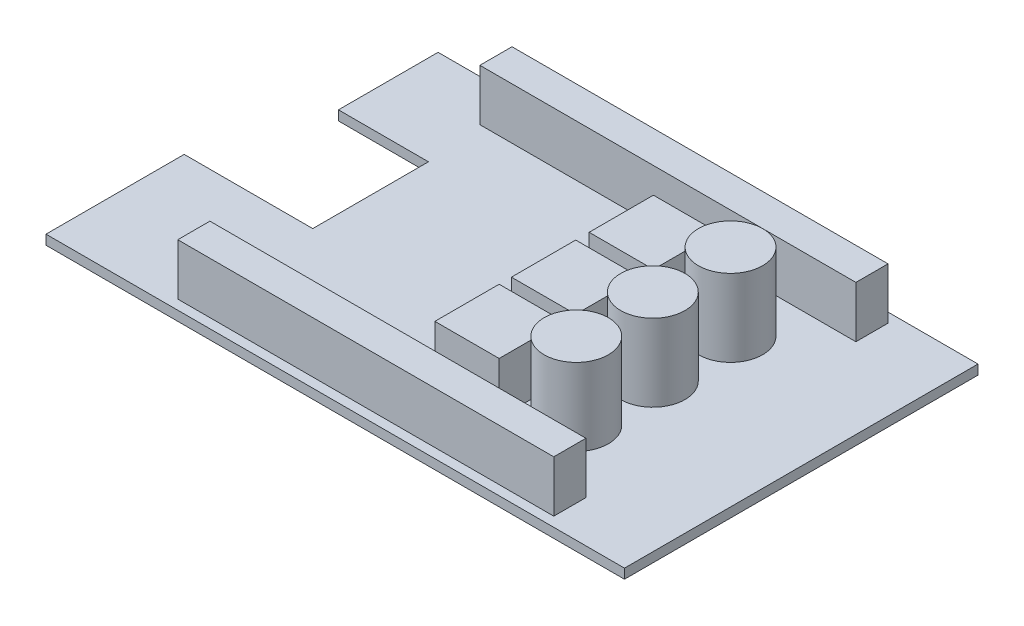
ISO-10303-21;
HEADER;
FILE_DESCRIPTION(('STEP AP214'),'2;1');
FILE_NAME('part.step','',(''),(''),'','','');
FILE_SCHEMA(('AUTOMOTIVE_DESIGN { 1 0 10303 214 1 1 1 1 }'));
ENDSEC;
DATA;
#1=APPLICATION_CONTEXT('core data for automotive mechanical design processes');
#2=APPLICATION_PROTOCOL_DEFINITION('international standard','automotive_design',2000,#1);
#3=PRODUCT_CONTEXT('',#1,'mechanical');
#4=PRODUCT('Part','Part','',(#3));
#5=PRODUCT_RELATED_PRODUCT_CATEGORY('part','',(#4));
#6=PRODUCT_DEFINITION_FORMATION('','',#4);
#7=PRODUCT_DEFINITION_CONTEXT('part definition',#1,'design');
#8=PRODUCT_DEFINITION('design','',#6,#7);
#9=PRODUCT_DEFINITION_SHAPE('','',#8);
#10=(LENGTH_UNIT() NAMED_UNIT(*) SI_UNIT(.MILLI.,.METRE.));
#11=(NAMED_UNIT(*) PLANE_ANGLE_UNIT() SI_UNIT($,.RADIAN.));
#12=(NAMED_UNIT(*) SI_UNIT($,.STERADIAN.) SOLID_ANGLE_UNIT());
#13=UNCERTAINTY_MEASURE_WITH_UNIT(LENGTH_MEASURE(1.E-05),#10,'distance_accuracy_value','');
#14=(GEOMETRIC_REPRESENTATION_CONTEXT(3) GLOBAL_UNCERTAINTY_ASSIGNED_CONTEXT((#13)) GLOBAL_UNIT_ASSIGNED_CONTEXT((#10,
#11,#12)) REPRESENTATION_CONTEXT('',''));
#15=CARTESIAN_POINT('',(0.,0.,0.));
#16=DIRECTION('',(0.,0.,1.));
#17=DIRECTION('',(1.,0.,0.));
#18=AXIS2_PLACEMENT_3D('',#15,#16,#17);
#19=CARTESIAN_POINT('',(0.,1.5,0.));
#20=DIRECTION('',(0.,1.,0.));
#21=DIRECTION('',(0.,0.,1.));
#22=AXIS2_PLACEMENT_3D('',#19,#20,#21);
#23=PLANE('',#22);
#24=CARTESIAN_POINT('',(67.,1.5,-5.91244865584822));
#25=DIRECTION('',(0.,1.,0.));
#26=DIRECTION('',(0.,0.,1.));
#27=AXIS2_PLACEMENT_3D('',#24,#25,#26);
#28=CIRCLE('',#27,5.);
#29=CARTESIAN_POINT('',(67.,1.5,-0.912448655848211));
#30=VERTEX_POINT('',#29);
#31=EDGE_CURVE('E854',#30,#30,#28,.T.);
#32=ORIENTED_EDGE('',*,*,#31,.F.);
#33=EDGE_LOOP('',(#32));
#34=FACE_BOUND('',#33,.T.);
#35=DIRECTION('',(-1.,0.,0.));
#36=VECTOR('',#35,1.);
#37=CARTESIAN_POINT('',(50.,1.5,0.999999999999992));
#38=LINE('',#37,#36);
#39=CARTESIAN_POINT('',(60.,1.5,0.999999999999992));
#40=VERTEX_POINT('',#39);
#41=CARTESIAN_POINT('',(50.,1.5,0.999999999999992));
#42=VERTEX_POINT('',#41);
#43=EDGE_CURVE('E251',#40,#42,#38,.T.);
#44=ORIENTED_EDGE('',*,*,#43,.F.);
#45=DIRECTION('',(0.,0.,-1.));
#46=VECTOR('',#45,1.);
#47=CARTESIAN_POINT('',(60.,1.5,11.));
#48=LINE('',#47,#46);
#49=CARTESIAN_POINT('',(60.,1.5,11.));
#50=VERTEX_POINT('',#49);
#51=EDGE_CURVE('E245',#50,#40,#48,.T.);
#52=ORIENTED_EDGE('',*,*,#51,.F.);
#53=DIRECTION('',(1.,0.,0.));
#54=VECTOR('',#53,1.);
#55=CARTESIAN_POINT('',(50.,1.5,11.));
#56=LINE('',#55,#54);
#57=CARTESIAN_POINT('',(50.,1.5,11.));
#58=VERTEX_POINT('',#57);
#59=EDGE_CURVE('E225',#58,#50,#56,.T.);
#60=ORIENTED_EDGE('',*,*,#59,.F.);
#61=DIRECTION('',(0.,0.,1.));
#62=VECTOR('',#61,1.);
#63=CARTESIAN_POINT('',(50.,1.5,11.));
#64=LINE('',#63,#62);
#65=EDGE_CURVE('E49',#42,#58,#64,.T.);
#66=ORIENTED_EDGE('',*,*,#65,.F.);
#67=EDGE_LOOP('',(#44,#52,#60,#66));
#68=FACE_BOUND('',#67,.T.);
#69=DIRECTION('',(-1.,0.,0.));
#70=VECTOR('',#69,1.);
#71=CARTESIAN_POINT('',(50.,1.5,-23.));
#72=LINE('',#71,#70);
#73=CARTESIAN_POINT('',(60.,1.5,-23.));
#74=VERTEX_POINT('',#73);
#75=CARTESIAN_POINT('',(50.,1.5,-23.));
#76=VERTEX_POINT('',#75);
#77=EDGE_CURVE('E292',#74,#76,#72,.T.);
#78=ORIENTED_EDGE('',*,*,#77,.F.);
#79=DIRECTION('',(0.,0.,-1.));
#80=VECTOR('',#79,1.);
#81=CARTESIAN_POINT('',(60.,1.5,-13.));
#82=LINE('',#81,#80);
#83=CARTESIAN_POINT('',(60.,1.5,-13.));
#84=VERTEX_POINT('',#83);
#85=EDGE_CURVE('E296',#84,#74,#82,.T.);
#86=ORIENTED_EDGE('',*,*,#85,.F.);
#87=DIRECTION('',(1.,0.,0.));
#88=VECTOR('',#87,1.);
#89=CARTESIAN_POINT('',(50.,1.5,-13.));
#90=LINE('',#89,#88);
#91=CARTESIAN_POINT('',(50.,1.5,-13.));
#92=VERTEX_POINT('',#91);
#93=EDGE_CURVE('E284',#92,#84,#90,.T.);
#94=ORIENTED_EDGE('',*,*,#93,.F.);
#95=DIRECTION('',(0.,0.,1.));
#96=VECTOR('',#95,1.);
#97=CARTESIAN_POINT('',(50.,1.5,-13.));
#98=LINE('',#97,#96);
#99=EDGE_CURVE('E289',#76,#92,#98,.T.);
#100=ORIENTED_EDGE('',*,*,#99,.F.);
#101=EDGE_LOOP('',(#78,#86,#94,#100));
#102=FACE_BOUND('',#101,.T.);
#103=DIRECTION('',(1.,0.,0.));
#104=VECTOR('',#103,1.);
#105=CARTESIAN_POINT('',(19.,1.5,20.));
#106=LINE('',#105,#104);
#107=CARTESIAN_POINT('',(19.,1.5,20.));
#108=VERTEX_POINT('',#107);
#109=CARTESIAN_POINT('',(77.5,1.5,20.));
#110=VERTEX_POINT('',#109);
#111=EDGE_CURVE('E358',#108,#110,#106,.T.);
#112=ORIENTED_EDGE('',*,*,#111,.F.);
#113=DIRECTION('',(0.,0.,1.));
#114=VECTOR('',#113,1.);
#115=CARTESIAN_POINT('',(19.,1.5,20.));
#116=LINE('',#115,#114);
#117=CARTESIAN_POINT('',(19.,1.5,15.));
#118=VERTEX_POINT('',#117);
#119=EDGE_CURVE('E344',#118,#108,#116,.T.);
#120=ORIENTED_EDGE('',*,*,#119,.F.);
#121=DIRECTION('',(-1.,0.,0.));
#122=VECTOR('',#121,1.);
#123=CARTESIAN_POINT('',(19.,1.5,15.));
#124=LINE('',#123,#122);
#125=CARTESIAN_POINT('',(77.5,1.5,15.));
#126=VERTEX_POINT('',#125);
#127=EDGE_CURVE('E349',#126,#118,#124,.T.);
#128=ORIENTED_EDGE('',*,*,#127,.F.);
#129=DIRECTION('',(0.,0.,-1.));
#130=VECTOR('',#129,1.);
#131=CARTESIAN_POINT('',(77.5,1.5,20.));
#132=LINE('',#131,#130);
#133=EDGE_CURVE('E360',#110,#126,#132,.T.);
#134=ORIENTED_EDGE('',*,*,#133,.F.);
#135=EDGE_LOOP('',(#112,#120,#128,#134));
#136=FACE_BOUND('',#135,.T.);
#137=DIRECTION('',(-1.,0.,0.));
#138=VECTOR('',#137,1.);
#139=CARTESIAN_POINT('',(20.,1.5,0.));
#140=LINE('',#139,#138);
#141=CARTESIAN_POINT('',(20.,1.5,0.));
#142=VERTEX_POINT('',#141);
#143=CARTESIAN_POINT('',(0.,1.5,0.));
#144=VERTEX_POINT('',#143);
#145=EDGE_CURVE('E374',#142,#144,#140,.T.);
#146=ORIENTED_EDGE('',*,*,#145,.T.);
#147=DIRECTION('',(0.,0.,1.));
#148=VECTOR('',#147,1.);
#149=CARTESIAN_POINT('',(0.,1.5,0.));
#150=LINE('',#149,#148);
#151=CARTESIAN_POINT('',(0.,1.5,21.5));
#152=VERTEX_POINT('',#151);
#153=EDGE_CURVE('E377',#144,#152,#150,.T.);
#154=ORIENTED_EDGE('',*,*,#153,.T.);
#155=DIRECTION('',(1.,0.,0.));
#156=VECTOR('',#155,1.);
#157=CARTESIAN_POINT('',(0.,1.5,21.5));
#158=LINE('',#157,#156);
#159=CARTESIAN_POINT('',(90.,1.5,21.5));
#160=VERTEX_POINT('',#159);
#161=EDGE_CURVE('E380',#152,#160,#158,.T.);
#162=ORIENTED_EDGE('',*,*,#161,.T.);
#163=DIRECTION('',(0.,0.,-1.));
#164=VECTOR('',#163,1.);
#165=CARTESIAN_POINT('',(90.,1.5,21.5));
#166=LINE('',#165,#164);
#167=CARTESIAN_POINT('',(90.,1.5,-33.5));
#168=VERTEX_POINT('',#167);
#169=EDGE_CURVE('E382',#160,#168,#166,.T.);
#170=ORIENTED_EDGE('',*,*,#169,.T.);
#171=DIRECTION('',(-1.,0.,0.));
#172=VECTOR('',#171,1.);
#173=CARTESIAN_POINT('',(90.,1.5,-33.5));
#174=LINE('',#173,#172);
#175=CARTESIAN_POINT('',(5.99999999999999,1.5,-33.5));
#176=VERTEX_POINT('',#175);
#177=EDGE_CURVE('E384',#168,#176,#174,.T.);
#178=ORIENTED_EDGE('',*,*,#177,.T.);
#179=DIRECTION('',(0.,0.,1.));
#180=VECTOR('',#179,1.);
#181=CARTESIAN_POINT('',(5.99999999999999,1.5,-33.5));
#182=LINE('',#181,#180);
#183=CARTESIAN_POINT('',(5.99999999999999,1.5,-18.));
#184=VERTEX_POINT('',#183);
#185=EDGE_CURVE('E386',#176,#184,#182,.T.);
#186=ORIENTED_EDGE('',*,*,#185,.T.);
#187=DIRECTION('',(1.,0.,0.));
#188=VECTOR('',#187,1.);
#189=CARTESIAN_POINT('',(5.99999999999999,1.5,-18.));
#190=LINE('',#189,#188);
#191=CARTESIAN_POINT('',(20.,1.5,-18.));
#192=VERTEX_POINT('',#191);
#193=EDGE_CURVE('E388',#184,#192,#190,.T.);
#194=ORIENTED_EDGE('',*,*,#193,.T.);
#195=DIRECTION('',(0.,0.,1.));
#196=VECTOR('',#195,1.);
#197=CARTESIAN_POINT('',(20.,1.5,-18.));
#198=LINE('',#197,#196);
#199=EDGE_CURVE('E390',#192,#142,#198,.T.);
#200=ORIENTED_EDGE('',*,*,#199,.T.);
#201=EDGE_LOOP('',(#146,#154,#162,#170,#178,#186,#194,#200));
#202=FACE_BOUND('',#201,.T.);
#203=DIRECTION('',(1.,0.,0.));
#204=VECTOR('',#203,1.);
#205=CARTESIAN_POINT('',(19.,1.5,-27.));
#206=LINE('',#205,#204);
#207=CARTESIAN_POINT('',(19.,1.5,-27.));
#208=VERTEX_POINT('',#207);
#209=CARTESIAN_POINT('',(77.5,1.5,-27.));
#210=VERTEX_POINT('',#209);
#211=EDGE_CURVE('E329',#208,#210,#206,.T.);
#212=ORIENTED_EDGE('',*,*,#211,.F.);
#213=DIRECTION('',(0.,0.,1.));
#214=VECTOR('',#213,1.);
#215=CARTESIAN_POINT('',(19.,1.5,-32.));
#216=LINE('',#215,#214);
#217=CARTESIAN_POINT('',(19.,1.5,-32.));
#218=VERTEX_POINT('',#217);
#219=EDGE_CURVE('E302',#218,#208,#216,.T.);
#220=ORIENTED_EDGE('',*,*,#219,.F.);
#221=DIRECTION('',(-1.,0.,0.));
#222=VECTOR('',#221,1.);
#223=CARTESIAN_POINT('',(19.,1.5,-32.));
#224=LINE('',#223,#222);
#225=CARTESIAN_POINT('',(77.5,1.5,-32.));
#226=VERTEX_POINT('',#225);
#227=EDGE_CURVE('E320',#226,#218,#224,.T.);
#228=ORIENTED_EDGE('',*,*,#227,.F.);
#229=DIRECTION('',(0.,0.,-1.));
#230=VECTOR('',#229,1.);
#231=CARTESIAN_POINT('',(77.5,1.5,-32.));
#232=LINE('',#231,#230);
#233=EDGE_CURVE('E331',#210,#226,#232,.T.);
#234=ORIENTED_EDGE('',*,*,#233,.F.);
#235=EDGE_LOOP('',(#212,#220,#228,#234));
#236=FACE_BOUND('',#235,.T.);
#237=DIRECTION('',(-1.,0.,0.));
#238=VECTOR('',#237,1.);
#239=CARTESIAN_POINT('',(50.,1.5,-10.9124486558482));
#240=LINE('',#239,#238);
#241=CARTESIAN_POINT('',(60.,1.5,-10.9124486558482));
#242=VERTEX_POINT('',#241);
#243=CARTESIAN_POINT('',(50.,1.5,-10.9124486558482));
#244=VERTEX_POINT('',#243);
#245=EDGE_CURVE('E263',#242,#244,#240,.T.);
#246=ORIENTED_EDGE('',*,*,#245,.F.);
#247=DIRECTION('',(0.,0.,-1.));
#248=VECTOR('',#247,1.);
#249=CARTESIAN_POINT('',(60.,1.5,-0.912448655848212));
#250=LINE('',#249,#248);
#251=CARTESIAN_POINT('',(60.,1.5,-0.912448655848212));
#252=VERTEX_POINT('',#251);
#253=EDGE_CURVE('E241',#252,#242,#250,.T.);
#254=ORIENTED_EDGE('',*,*,#253,.F.);
#255=DIRECTION('',(1.,0.,0.));
#256=VECTOR('',#255,1.);
#257=CARTESIAN_POINT('',(50.,1.5,-0.912448655848212));
#258=LINE('',#257,#256);
#259=CARTESIAN_POINT('',(50.,1.5,-0.912448655848212));
#260=VERTEX_POINT('',#259);
#261=EDGE_CURVE('E256',#260,#252,#258,.T.);
#262=ORIENTED_EDGE('',*,*,#261,.F.);
#263=DIRECTION('',(0.,0.,1.));
#264=VECTOR('',#263,1.);
#265=CARTESIAN_POINT('',(50.,1.5,-0.912448655848212));
#266=LINE('',#265,#264);
#267=EDGE_CURVE('E57',#244,#260,#266,.T.);
#268=ORIENTED_EDGE('',*,*,#267,.F.);
#269=EDGE_LOOP('',(#246,#254,#262,#268));
#270=FACE_BOUND('',#269,.T.);
#271=CARTESIAN_POINT('',(67.,1.5,-18.));
#272=DIRECTION('',(0.,1.,0.));
#273=DIRECTION('',(0.,0.,1.));
#274=AXIS2_PLACEMENT_3D('',#271,#272,#273);
#275=CIRCLE('',#274,5.);
#276=CARTESIAN_POINT('',(67.,1.5,-13.));
#277=VERTEX_POINT('',#276);
#278=EDGE_CURVE('E865',#277,#277,#275,.T.);
#279=ORIENTED_EDGE('',*,*,#278,.F.);
#280=EDGE_LOOP('',(#279));
#281=FACE_BOUND('',#280,.T.);
#282=CARTESIAN_POINT('',(67.,1.5,5.99999999999999));
#283=DIRECTION('',(0.,1.,0.));
#284=DIRECTION('',(0.,0.,1.));
#285=AXIS2_PLACEMENT_3D('',#282,#283,#284);
#286=CIRCLE('',#285,5.);
#287=CARTESIAN_POINT('',(67.,1.5,11.));
#288=VERTEX_POINT('',#287);
#289=EDGE_CURVE('E855',#288,#288,#286,.T.);
#290=ORIENTED_EDGE('',*,*,#289,.F.);
#291=EDGE_LOOP('',(#290));
#292=FACE_BOUND('',#291,.T.);
#293=ADVANCED_FACE('F34',(#34,#68,#102,#136,#202,#236,#270,#281,#292),#23,.T.);
#294=CARTESIAN_POINT('',(20.,1.5,0.));
#295=DIRECTION('',(0.,0.,1.));
#296=DIRECTION('',(1.,0.,0.));
#297=AXIS2_PLACEMENT_3D('',#294,#295,#296);
#298=PLANE('',#297);
#299=DIRECTION('',(-1.,0.,0.));
#300=VECTOR('',#299,1.);
#301=CARTESIAN_POINT('',(20.,0.,0.));
#302=LINE('',#301,#300);
#303=CARTESIAN_POINT('',(20.,0.,0.));
#304=VERTEX_POINT('',#303);
#305=CARTESIAN_POINT('',(0.,0.,0.));
#306=VERTEX_POINT('',#305);
#307=EDGE_CURVE('E373',#304,#306,#302,.T.);
#308=ORIENTED_EDGE('',*,*,#307,.T.);
#309=DIRECTION('',(0.,-1.,0.));
#310=VECTOR('',#309,1.);
#311=CARTESIAN_POINT('',(0.,1.5,0.));
#312=LINE('',#311,#310);
#313=EDGE_CURVE('E12',#144,#306,#312,.T.);
#314=ORIENTED_EDGE('',*,*,#313,.F.);
#315=ORIENTED_EDGE('',*,*,#145,.F.);
#316=DIRECTION('',(0.,-1.,0.));
#317=VECTOR('',#316,1.);
#318=CARTESIAN_POINT('',(20.,1.5,0.));
#319=LINE('',#318,#317);
#320=EDGE_CURVE('E392',#142,#304,#319,.T.);
#321=ORIENTED_EDGE('',*,*,#320,.T.);
#322=EDGE_LOOP('',(#308,#314,#315,#321));
#323=FACE_BOUND('',#322,.T.);
#324=ADVANCED_FACE('F36',(#323),#298,.F.);
#325=CARTESIAN_POINT('',(0.,1.5,0.));
#326=DIRECTION('',(1.,0.,0.));
#327=DIRECTION('',(0.,0.,-1.));
#328=AXIS2_PLACEMENT_3D('',#325,#326,#327);
#329=PLANE('',#328);
#330=DIRECTION('',(0.,0.,1.));
#331=VECTOR('',#330,1.);
#332=CARTESIAN_POINT('',(0.,0.,0.));
#333=LINE('',#332,#331);
#334=CARTESIAN_POINT('',(0.,0.,21.5));
#335=VERTEX_POINT('',#334);
#336=EDGE_CURVE('E395',#306,#335,#333,.T.);
#337=ORIENTED_EDGE('',*,*,#336,.T.);
#338=DIRECTION('',(0.,-1.,0.));
#339=VECTOR('',#338,1.);
#340=CARTESIAN_POINT('',(0.,1.5,21.5));
#341=LINE('',#340,#339);
#342=EDGE_CURVE('E42',#152,#335,#341,.T.);
#343=ORIENTED_EDGE('',*,*,#342,.F.);
#344=ORIENTED_EDGE('',*,*,#153,.F.);
#345=ORIENTED_EDGE('',*,*,#313,.T.);
#346=EDGE_LOOP('',(#337,#343,#344,#345));
#347=FACE_BOUND('',#346,.T.);
#348=ADVANCED_FACE('F452',(#347),#329,.F.);
#349=CARTESIAN_POINT('',(0.,1.5,21.5));
#350=DIRECTION('',(0.,0.,-1.));
#351=DIRECTION('',(-1.,0.,0.));
#352=AXIS2_PLACEMENT_3D('',#349,#350,#351);
#353=PLANE('',#352);
#354=DIRECTION('',(1.,0.,0.));
#355=VECTOR('',#354,1.);
#356=CARTESIAN_POINT('',(0.,0.,21.5));
#357=LINE('',#356,#355);
#358=CARTESIAN_POINT('',(90.,0.,21.5));
#359=VERTEX_POINT('',#358);
#360=EDGE_CURVE('E397',#335,#359,#357,.T.);
#361=ORIENTED_EDGE('',*,*,#360,.T.);
#362=DIRECTION('',(0.,-1.,0.));
#363=VECTOR('',#362,1.);
#364=CARTESIAN_POINT('',(90.,1.5,21.5));
#365=LINE('',#364,#363);
#366=EDGE_CURVE('E422',#160,#359,#365,.T.);
#367=ORIENTED_EDGE('',*,*,#366,.F.);
#368=ORIENTED_EDGE('',*,*,#161,.F.);
#369=ORIENTED_EDGE('',*,*,#342,.T.);
#370=EDGE_LOOP('',(#361,#367,#368,#369));
#371=FACE_BOUND('',#370,.T.);
#372=ADVANCED_FACE('F429',(#371),#353,.F.);
#373=CARTESIAN_POINT('',(90.,1.5,21.5));
#374=DIRECTION('',(-1.,0.,0.));
#375=DIRECTION('',(0.,0.,1.));
#376=AXIS2_PLACEMENT_3D('',#373,#374,#375);
#377=PLANE('',#376);
#378=DIRECTION('',(0.,0.,-1.));
#379=VECTOR('',#378,1.);
#380=CARTESIAN_POINT('',(90.,0.,21.5));
#381=LINE('',#380,#379);
#382=CARTESIAN_POINT('',(90.,0.,-33.5));
#383=VERTEX_POINT('',#382);
#384=EDGE_CURVE('E399',#359,#383,#381,.T.);
#385=ORIENTED_EDGE('',*,*,#384,.T.);
#386=DIRECTION('',(0.,-1.,0.));
#387=VECTOR('',#386,1.);
#388=CARTESIAN_POINT('',(90.,1.5,-33.5));
#389=LINE('',#388,#387);
#390=EDGE_CURVE('E419',#168,#383,#389,.T.);
#391=ORIENTED_EDGE('',*,*,#390,.F.);
#392=ORIENTED_EDGE('',*,*,#169,.F.);
#393=ORIENTED_EDGE('',*,*,#366,.T.);
#394=EDGE_LOOP('',(#385,#391,#392,#393));
#395=FACE_BOUND('',#394,.T.);
#396=ADVANCED_FACE('F440',(#395),#377,.F.);
#397=CARTESIAN_POINT('',(90.,1.5,-33.5));
#398=DIRECTION('',(0.,0.,1.));
#399=DIRECTION('',(1.,0.,0.));
#400=AXIS2_PLACEMENT_3D('',#397,#398,#399);
#401=PLANE('',#400);
#402=DIRECTION('',(-1.,0.,0.));
#403=VECTOR('',#402,1.);
#404=CARTESIAN_POINT('',(90.,0.,-33.5));
#405=LINE('',#404,#403);
#406=CARTESIAN_POINT('',(5.99999999999999,0.,-33.5));
#407=VERTEX_POINT('',#406);
#408=EDGE_CURVE('E401',#383,#407,#405,.T.);
#409=ORIENTED_EDGE('',*,*,#408,.T.);
#410=DIRECTION('',(0.,-1.,0.));
#411=VECTOR('',#410,1.);
#412=CARTESIAN_POINT('',(5.99999999999999,1.5,-33.5));
#413=LINE('',#412,#411);
#414=EDGE_CURVE('E416',#176,#407,#413,.T.);
#415=ORIENTED_EDGE('',*,*,#414,.F.);
#416=ORIENTED_EDGE('',*,*,#177,.F.);
#417=ORIENTED_EDGE('',*,*,#390,.T.);
#418=EDGE_LOOP('',(#409,#415,#416,#417));
#419=FACE_BOUND('',#418,.T.);
#420=ADVANCED_FACE('F444',(#419),#401,.F.);
#421=CARTESIAN_POINT('',(5.99999999999999,1.5,-33.5));
#422=DIRECTION('',(1.,0.,0.));
#423=DIRECTION('',(0.,0.,-1.));
#424=AXIS2_PLACEMENT_3D('',#421,#422,#423);
#425=PLANE('',#424);
#426=DIRECTION('',(0.,0.,1.));
#427=VECTOR('',#426,1.);
#428=CARTESIAN_POINT('',(5.99999999999999,0.,-33.5));
#429=LINE('',#428,#427);
#430=CARTESIAN_POINT('',(5.99999999999999,0.,-18.));
#431=VERTEX_POINT('',#430);
#432=EDGE_CURVE('E403',#407,#431,#429,.T.);
#433=ORIENTED_EDGE('',*,*,#432,.T.);
#434=DIRECTION('',(0.,-1.,0.));
#435=VECTOR('',#434,1.);
#436=CARTESIAN_POINT('',(5.99999999999999,1.5,-18.));
#437=LINE('',#436,#435);
#438=EDGE_CURVE('E413',#184,#431,#437,.T.);
#439=ORIENTED_EDGE('',*,*,#438,.F.);
#440=ORIENTED_EDGE('',*,*,#185,.F.);
#441=ORIENTED_EDGE('',*,*,#414,.T.);
#442=EDGE_LOOP('',(#433,#439,#440,#441));
#443=FACE_BOUND('',#442,.T.);
#444=ADVANCED_FACE('F465',(#443),#425,.F.);
#445=CARTESIAN_POINT('',(5.99999999999999,1.5,-18.));
#446=DIRECTION('',(0.,0.,-1.));
#447=DIRECTION('',(-1.,0.,0.));
#448=AXIS2_PLACEMENT_3D('',#445,#446,#447);
#449=PLANE('',#448);
#450=DIRECTION('',(1.,0.,0.));
#451=VECTOR('',#450,1.);
#452=CARTESIAN_POINT('',(5.99999999999999,0.,-18.));
#453=LINE('',#452,#451);
#454=CARTESIAN_POINT('',(20.,0.,-18.));
#455=VERTEX_POINT('',#454);
#456=EDGE_CURVE('E405',#431,#455,#453,.T.);
#457=ORIENTED_EDGE('',*,*,#456,.T.);
#458=DIRECTION('',(0.,-1.,0.));
#459=VECTOR('',#458,1.);
#460=CARTESIAN_POINT('',(20.,1.5,-18.));
#461=LINE('',#460,#459);
#462=EDGE_CURVE('E410',#192,#455,#461,.T.);
#463=ORIENTED_EDGE('',*,*,#462,.F.);
#464=ORIENTED_EDGE('',*,*,#193,.F.);
#465=ORIENTED_EDGE('',*,*,#438,.T.);
#466=EDGE_LOOP('',(#457,#463,#464,#465));
#467=FACE_BOUND('',#466,.T.);
#468=ADVANCED_FACE('F463',(#467),#449,.F.);
#469=CARTESIAN_POINT('',(20.,1.5,-18.));
#470=DIRECTION('',(1.,0.,0.));
#471=DIRECTION('',(0.,0.,-1.));
#472=AXIS2_PLACEMENT_3D('',#469,#470,#471);
#473=PLANE('',#472);
#474=DIRECTION('',(0.,0.,1.));
#475=VECTOR('',#474,1.);
#476=CARTESIAN_POINT('',(20.,0.,-18.));
#477=LINE('',#476,#475);
#478=EDGE_CURVE('E378',#455,#304,#477,.T.);
#479=ORIENTED_EDGE('',*,*,#478,.T.);
#480=ORIENTED_EDGE('',*,*,#320,.F.);
#481=ORIENTED_EDGE('',*,*,#199,.F.);
#482=ORIENTED_EDGE('',*,*,#462,.T.);
#483=EDGE_LOOP('',(#479,#480,#481,#482));
#484=FACE_BOUND('',#483,.T.);
#485=ADVANCED_FACE('F458',(#484),#473,.F.);
#486=CARTESIAN_POINT('',(0.,0.,0.));
#487=DIRECTION('',(0.,1.,0.));
#488=DIRECTION('',(0.,0.,1.));
#489=AXIS2_PLACEMENT_3D('',#486,#487,#488);
#490=PLANE('',#489);
#491=ORIENTED_EDGE('',*,*,#307,.F.);
#492=ORIENTED_EDGE('',*,*,#478,.F.);
#493=ORIENTED_EDGE('',*,*,#456,.F.);
#494=ORIENTED_EDGE('',*,*,#432,.F.);
#495=ORIENTED_EDGE('',*,*,#408,.F.);
#496=ORIENTED_EDGE('',*,*,#384,.F.);
#497=ORIENTED_EDGE('',*,*,#360,.F.);
#498=ORIENTED_EDGE('',*,*,#336,.F.);
#499=EDGE_LOOP('',(#491,#492,#493,#494,#495,#496,#497,#498));
#500=FACE_BOUND('',#499,.T.);
#501=ADVANCED_FACE('F435',(#500),#490,.F.);
#502=CARTESIAN_POINT('',(19.,9.5,20.));
#503=DIRECTION('',(1.,0.,0.));
#504=DIRECTION('',(0.,0.,-1.));
#505=AXIS2_PLACEMENT_3D('',#502,#503,#504);
#506=PLANE('',#505);
#507=ORIENTED_EDGE('',*,*,#119,.T.);
#508=DIRECTION('',(0.,-1.,0.));
#509=VECTOR('',#508,1.);
#510=CARTESIAN_POINT('',(19.,9.5,20.));
#511=LINE('',#510,#509);
#512=CARTESIAN_POINT('',(19.,9.5,20.));
#513=VERTEX_POINT('',#512);
#514=EDGE_CURVE('E371',#513,#108,#511,.T.);
#515=ORIENTED_EDGE('',*,*,#514,.F.);
#516=DIRECTION('',(0.,0.,1.));
#517=VECTOR('',#516,1.);
#518=CARTESIAN_POINT('',(19.,9.5,20.));
#519=LINE('',#518,#517);
#520=CARTESIAN_POINT('',(19.,9.5,15.));
#521=VERTEX_POINT('',#520);
#522=EDGE_CURVE('E345',#521,#513,#519,.T.);
#523=ORIENTED_EDGE('',*,*,#522,.F.);
#524=DIRECTION('',(0.,-1.,0.));
#525=VECTOR('',#524,1.);
#526=CARTESIAN_POINT('',(19.,9.5,15.));
#527=LINE('',#526,#525);
#528=EDGE_CURVE('E355',#521,#118,#527,.T.);
#529=ORIENTED_EDGE('',*,*,#528,.T.);
#530=EDGE_LOOP('',(#507,#515,#523,#529));
#531=FACE_BOUND('',#530,.T.);
#532=ADVANCED_FACE('F484',(#531),#506,.F.);
#533=CARTESIAN_POINT('',(19.,9.5,20.));
#534=DIRECTION('',(0.,0.,-1.));
#535=DIRECTION('',(-1.,0.,0.));
#536=AXIS2_PLACEMENT_3D('',#533,#534,#535);
#537=PLANE('',#536);
#538=ORIENTED_EDGE('',*,*,#111,.T.);
#539=DIRECTION('',(0.,-1.,0.));
#540=VECTOR('',#539,1.);
#541=CARTESIAN_POINT('',(77.5,9.5,20.));
#542=LINE('',#541,#540);
#543=CARTESIAN_POINT('',(77.5,9.5,20.));
#544=VERTEX_POINT('',#543);
#545=EDGE_CURVE('E368',#544,#110,#542,.T.);
#546=ORIENTED_EDGE('',*,*,#545,.F.);
#547=DIRECTION('',(1.,0.,0.));
#548=VECTOR('',#547,1.);
#549=CARTESIAN_POINT('',(19.,9.5,20.));
#550=LINE('',#549,#548);
#551=EDGE_CURVE('E348',#513,#544,#550,.T.);
#552=ORIENTED_EDGE('',*,*,#551,.F.);
#553=ORIENTED_EDGE('',*,*,#514,.T.);
#554=EDGE_LOOP('',(#538,#546,#552,#553));
#555=FACE_BOUND('',#554,.T.);
#556=ADVANCED_FACE('F503',(#555),#537,.F.);
#557=CARTESIAN_POINT('',(77.5,9.5,20.));
#558=DIRECTION('',(-1.,0.,0.));
#559=DIRECTION('',(0.,0.,1.));
#560=AXIS2_PLACEMENT_3D('',#557,#558,#559);
#561=PLANE('',#560);
#562=ORIENTED_EDGE('',*,*,#133,.T.);
#563=DIRECTION('',(0.,-1.,0.));
#564=VECTOR('',#563,1.);
#565=CARTESIAN_POINT('',(77.5,9.5,15.));
#566=LINE('',#565,#564);
#567=CARTESIAN_POINT('',(77.5,9.5,15.));
#568=VERTEX_POINT('',#567);
#569=EDGE_CURVE('E366',#568,#126,#566,.T.);
#570=ORIENTED_EDGE('',*,*,#569,.F.);
#571=DIRECTION('',(0.,0.,-1.));
#572=VECTOR('',#571,1.);
#573=CARTESIAN_POINT('',(77.5,9.5,20.));
#574=LINE('',#573,#572);
#575=EDGE_CURVE('E351',#544,#568,#574,.T.);
#576=ORIENTED_EDGE('',*,*,#575,.F.);
#577=ORIENTED_EDGE('',*,*,#545,.T.);
#578=EDGE_LOOP('',(#562,#570,#576,#577));
#579=FACE_BOUND('',#578,.T.);
#580=ADVANCED_FACE('F510',(#579),#561,.F.);
#581=CARTESIAN_POINT('',(19.,9.5,15.));
#582=DIRECTION('',(0.,0.,1.));
#583=DIRECTION('',(1.,0.,0.));
#584=AXIS2_PLACEMENT_3D('',#581,#582,#583);
#585=PLANE('',#584);
#586=ORIENTED_EDGE('',*,*,#127,.T.);
#587=ORIENTED_EDGE('',*,*,#528,.F.);
#588=DIRECTION('',(-1.,0.,0.));
#589=VECTOR('',#588,1.);
#590=CARTESIAN_POINT('',(19.,9.5,15.));
#591=LINE('',#590,#589);
#592=EDGE_CURVE('E353',#568,#521,#591,.T.);
#593=ORIENTED_EDGE('',*,*,#592,.F.);
#594=ORIENTED_EDGE('',*,*,#569,.T.);
#595=EDGE_LOOP('',(#586,#587,#593,#594));
#596=FACE_BOUND('',#595,.T.);
#597=ADVANCED_FACE('F517',(#596),#585,.F.);
#598=CARTESIAN_POINT('',(0.,9.5,0.));
#599=DIRECTION('',(0.,-1.,0.));
#600=DIRECTION('',(0.,0.,-1.));
#601=AXIS2_PLACEMENT_3D('',#598,#599,#600);
#602=PLANE('',#601);
#603=ORIENTED_EDGE('',*,*,#522,.T.);
#604=ORIENTED_EDGE('',*,*,#551,.T.);
#605=ORIENTED_EDGE('',*,*,#575,.T.);
#606=ORIENTED_EDGE('',*,*,#592,.T.);
#607=EDGE_LOOP('',(#603,#604,#605,#606));
#608=FACE_BOUND('',#607,.T.);
#609=ADVANCED_FACE('F525',(#608),#602,.F.);
#610=CARTESIAN_POINT('',(19.,9.5,-32.));
#611=DIRECTION('',(1.,0.,0.));
#612=DIRECTION('',(0.,0.,-1.));
#613=AXIS2_PLACEMENT_3D('',#610,#611,#612);
#614=PLANE('',#613);
#615=ORIENTED_EDGE('',*,*,#219,.T.);
#616=DIRECTION('',(0.,-1.,0.));
#617=VECTOR('',#616,1.);
#618=CARTESIAN_POINT('',(19.,9.5,-27.));
#619=LINE('',#618,#617);
#620=CARTESIAN_POINT('',(19.,9.5,-27.));
#621=VERTEX_POINT('',#620);
#622=EDGE_CURVE('E342',#621,#208,#619,.T.);
#623=ORIENTED_EDGE('',*,*,#622,.F.);
#624=DIRECTION('',(0.,0.,1.));
#625=VECTOR('',#624,1.);
#626=CARTESIAN_POINT('',(19.,9.5,-32.));
#627=LINE('',#626,#625);
#628=CARTESIAN_POINT('',(19.,9.5,-32.));
#629=VERTEX_POINT('',#628);
#630=EDGE_CURVE('E316',#629,#621,#627,.T.);
#631=ORIENTED_EDGE('',*,*,#630,.F.);
#632=DIRECTION('',(0.,-1.,0.));
#633=VECTOR('',#632,1.);
#634=CARTESIAN_POINT('',(19.,9.5,-32.));
#635=LINE('',#634,#633);
#636=EDGE_CURVE('E326',#629,#218,#635,.T.);
#637=ORIENTED_EDGE('',*,*,#636,.T.);
#638=EDGE_LOOP('',(#615,#623,#631,#637));
#639=FACE_BOUND('',#638,.T.);
#640=ADVANCED_FACE('F533',(#639),#614,.F.);
#641=CARTESIAN_POINT('',(19.,9.5,-27.));
#642=DIRECTION('',(0.,0.,-1.));
#643=DIRECTION('',(-1.,0.,0.));
#644=AXIS2_PLACEMENT_3D('',#641,#642,#643);
#645=PLANE('',#644);
#646=ORIENTED_EDGE('',*,*,#211,.T.);
#647=DIRECTION('',(0.,-1.,0.));
#648=VECTOR('',#647,1.);
#649=CARTESIAN_POINT('',(77.5,9.5,-27.));
#650=LINE('',#649,#648);
#651=CARTESIAN_POINT('',(77.5,9.5,-27.));
#652=VERTEX_POINT('',#651);
#653=EDGE_CURVE('E339',#652,#210,#650,.T.);
#654=ORIENTED_EDGE('',*,*,#653,.F.);
#655=DIRECTION('',(1.,0.,0.));
#656=VECTOR('',#655,1.);
#657=CARTESIAN_POINT('',(19.,9.5,-27.));
#658=LINE('',#657,#656);
#659=EDGE_CURVE('E319',#621,#652,#658,.T.);
#660=ORIENTED_EDGE('',*,*,#659,.F.);
#661=ORIENTED_EDGE('',*,*,#622,.T.);
#662=EDGE_LOOP('',(#646,#654,#660,#661));
#663=FACE_BOUND('',#662,.T.);
#664=ADVANCED_FACE('F541',(#663),#645,.F.);
#665=CARTESIAN_POINT('',(77.5,9.5,-32.));
#666=DIRECTION('',(-1.,0.,0.));
#667=DIRECTION('',(0.,0.,1.));
#668=AXIS2_PLACEMENT_3D('',#665,#666,#667);
#669=PLANE('',#668);
#670=ORIENTED_EDGE('',*,*,#233,.T.);
#671=DIRECTION('',(0.,-1.,0.));
#672=VECTOR('',#671,1.);
#673=CARTESIAN_POINT('',(77.5,9.5,-32.));
#674=LINE('',#673,#672);
#675=CARTESIAN_POINT('',(77.5,9.5,-32.));
#676=VERTEX_POINT('',#675);
#677=EDGE_CURVE('E337',#676,#226,#674,.T.);
#678=ORIENTED_EDGE('',*,*,#677,.F.);
#679=DIRECTION('',(0.,0.,-1.));
#680=VECTOR('',#679,1.);
#681=CARTESIAN_POINT('',(77.5,9.5,-32.));
#682=LINE('',#681,#680);
#683=EDGE_CURVE('E322',#652,#676,#682,.T.);
#684=ORIENTED_EDGE('',*,*,#683,.F.);
#685=ORIENTED_EDGE('',*,*,#653,.T.);
#686=EDGE_LOOP('',(#670,#678,#684,#685));
#687=FACE_BOUND('',#686,.T.);
#688=ADVANCED_FACE('F549',(#687),#669,.F.);
#689=CARTESIAN_POINT('',(19.,9.5,-32.));
#690=DIRECTION('',(0.,0.,1.));
#691=DIRECTION('',(1.,0.,0.));
#692=AXIS2_PLACEMENT_3D('',#689,#690,#691);
#693=PLANE('',#692);
#694=ORIENTED_EDGE('',*,*,#227,.T.);
#695=ORIENTED_EDGE('',*,*,#636,.F.);
#696=DIRECTION('',(-1.,0.,0.));
#697=VECTOR('',#696,1.);
#698=CARTESIAN_POINT('',(19.,9.5,-32.));
#699=LINE('',#698,#697);
#700=EDGE_CURVE('E324',#676,#629,#699,.T.);
#701=ORIENTED_EDGE('',*,*,#700,.F.);
#702=ORIENTED_EDGE('',*,*,#677,.T.);
#703=EDGE_LOOP('',(#694,#695,#701,#702));
#704=FACE_BOUND('',#703,.T.);
#705=ADVANCED_FACE('F557',(#704),#693,.F.);
#706=CARTESIAN_POINT('',(0.,9.5,0.));
#707=DIRECTION('',(0.,1.,0.));
#708=DIRECTION('',(0.,0.,1.));
#709=AXIS2_PLACEMENT_3D('',#706,#707,#708);
#710=PLANE('',#709);
#711=ORIENTED_EDGE('',*,*,#630,.T.);
#712=ORIENTED_EDGE('',*,*,#659,.T.);
#713=ORIENTED_EDGE('',*,*,#683,.T.);
#714=ORIENTED_EDGE('',*,*,#700,.T.);
#715=EDGE_LOOP('',(#711,#712,#713,#714));
#716=FACE_BOUND('',#715,.T.);
#717=ADVANCED_FACE('F565',(#716),#710,.T.);
#718=CARTESIAN_POINT('',(60.,23.642135623731,-13.));
#719=DIRECTION('',(-1.,0.,0.));
#720=DIRECTION('',(0.,0.,1.));
#721=AXIS2_PLACEMENT_3D('',#718,#719,#720);
#722=PLANE('',#721);
#723=DIRECTION('',(0.,0.,-1.));
#724=VECTOR('',#723,1.);
#725=CARTESIAN_POINT('',(60.,9.5,-13.));
#726=LINE('',#725,#724);
#727=CARTESIAN_POINT('',(60.,9.5,-13.));
#728=VERTEX_POINT('',#727);
#729=CARTESIAN_POINT('',(60.,9.5,-23.));
#730=VERTEX_POINT('',#729);
#731=EDGE_CURVE('E306',#728,#730,#726,.T.);
#732=ORIENTED_EDGE('',*,*,#731,.F.);
#733=DIRECTION('',(0.,-1.,0.));
#734=VECTOR('',#733,1.);
#735=CARTESIAN_POINT('',(60.,23.642135623731,-13.));
#736=LINE('',#735,#734);
#737=EDGE_CURVE('E272',#728,#84,#736,.T.);
#738=ORIENTED_EDGE('',*,*,#737,.T.);
#739=ORIENTED_EDGE('',*,*,#85,.T.);
#740=DIRECTION('',(0.,-1.,0.));
#741=VECTOR('',#740,1.);
#742=CARTESIAN_POINT('',(60.,23.642135623731,-23.));
#743=LINE('',#742,#741);
#744=EDGE_CURVE('E295',#730,#74,#743,.T.);
#745=ORIENTED_EDGE('',*,*,#744,.F.);
#746=EDGE_LOOP('',(#732,#738,#739,#745));
#747=FACE_BOUND('',#746,.T.);
#748=ADVANCED_FACE('F573',(#747),#722,.F.);
#749=CARTESIAN_POINT('',(50.,23.642135623731,-23.));
#750=DIRECTION('',(0.,0.,1.));
#751=DIRECTION('',(1.,0.,0.));
#752=AXIS2_PLACEMENT_3D('',#749,#750,#751);
#753=PLANE('',#752);
#754=DIRECTION('',(-1.,0.,0.));
#755=VECTOR('',#754,1.);
#756=CARTESIAN_POINT('',(50.,9.5,-23.));
#757=LINE('',#756,#755);
#758=CARTESIAN_POINT('',(50.,9.5,-23.));
#759=VERTEX_POINT('',#758);
#760=EDGE_CURVE('E303',#730,#759,#757,.T.);
#761=ORIENTED_EDGE('',*,*,#760,.F.);
#762=ORIENTED_EDGE('',*,*,#744,.T.);
#763=ORIENTED_EDGE('',*,*,#77,.T.);
#764=DIRECTION('',(0.,-1.,0.));
#765=VECTOR('',#764,1.);
#766=CARTESIAN_POINT('',(50.,23.642135623731,-23.));
#767=LINE('',#766,#765);
#768=EDGE_CURVE('E291',#759,#76,#767,.T.);
#769=ORIENTED_EDGE('',*,*,#768,.F.);
#770=EDGE_LOOP('',(#761,#762,#763,#769));
#771=FACE_BOUND('',#770,.T.);
#772=ADVANCED_FACE('F581',(#771),#753,.F.);
#773=CARTESIAN_POINT('',(50.,23.642135623731,-13.));
#774=DIRECTION('',(1.,0.,0.));
#775=DIRECTION('',(0.,0.,-1.));
#776=AXIS2_PLACEMENT_3D('',#773,#774,#775);
#777=PLANE('',#776);
#778=DIRECTION('',(0.,0.,1.));
#779=VECTOR('',#778,1.);
#780=CARTESIAN_POINT('',(50.,9.5,-13.));
#781=LINE('',#780,#779);
#782=CARTESIAN_POINT('',(50.,9.5,-13.));
#783=VERTEX_POINT('',#782);
#784=EDGE_CURVE('E299',#759,#783,#781,.T.);
#785=ORIENTED_EDGE('',*,*,#784,.F.);
#786=ORIENTED_EDGE('',*,*,#768,.T.);
#787=ORIENTED_EDGE('',*,*,#99,.T.);
#788=DIRECTION('',(0.,-1.,0.));
#789=VECTOR('',#788,1.);
#790=CARTESIAN_POINT('',(50.,23.642135623731,-13.));
#791=LINE('',#790,#789);
#792=EDGE_CURVE('E288',#783,#92,#791,.T.);
#793=ORIENTED_EDGE('',*,*,#792,.F.);
#794=EDGE_LOOP('',(#785,#786,#787,#793));
#795=FACE_BOUND('',#794,.T.);
#796=ADVANCED_FACE('F589',(#795),#777,.F.);
#797=CARTESIAN_POINT('',(50.,23.642135623731,-13.));
#798=DIRECTION('',(0.,0.,-1.));
#799=DIRECTION('',(-1.,0.,0.));
#800=AXIS2_PLACEMENT_3D('',#797,#798,#799);
#801=PLANE('',#800);
#802=DIRECTION('',(1.,0.,0.));
#803=VECTOR('',#802,1.);
#804=CARTESIAN_POINT('',(50.,9.5,-13.));
#805=LINE('',#804,#803);
#806=EDGE_CURVE('E287',#783,#728,#805,.T.);
#807=ORIENTED_EDGE('',*,*,#806,.F.);
#808=ORIENTED_EDGE('',*,*,#792,.T.);
#809=ORIENTED_EDGE('',*,*,#93,.T.);
#810=ORIENTED_EDGE('',*,*,#737,.F.);
#811=EDGE_LOOP('',(#807,#808,#809,#810));
#812=FACE_BOUND('',#811,.T.);
#813=ADVANCED_FACE('F597',(#812),#801,.F.);
#814=CARTESIAN_POINT('',(0.,9.5,0.));
#815=DIRECTION('',(0.,1.,0.));
#816=DIRECTION('',(0.,0.,1.));
#817=AXIS2_PLACEMENT_3D('',#814,#815,#816);
#818=PLANE('',#817);
#819=ORIENTED_EDGE('',*,*,#806,.T.);
#820=ORIENTED_EDGE('',*,*,#731,.T.);
#821=ORIENTED_EDGE('',*,*,#760,.T.);
#822=ORIENTED_EDGE('',*,*,#784,.T.);
#823=EDGE_LOOP('',(#819,#820,#821,#822));
#824=FACE_BOUND('',#823,.T.);
#825=ADVANCED_FACE('F605',(#824),#818,.T.);
#826=CARTESIAN_POINT('',(60.,23.642135623731,-0.912448655848212));
#827=DIRECTION('',(-1.,0.,0.));
#828=DIRECTION('',(0.,0.,1.));
#829=AXIS2_PLACEMENT_3D('',#826,#827,#828);
#830=PLANE('',#829);
#831=DIRECTION('',(0.,0.,-1.));
#832=VECTOR('',#831,1.);
#833=CARTESIAN_POINT('',(60.,9.5,-0.912448655848212));
#834=LINE('',#833,#832);
#835=CARTESIAN_POINT('',(60.,9.5,-0.912448655848212));
#836=VERTEX_POINT('',#835);
#837=CARTESIAN_POINT('',(60.,9.5,-10.9124486558482));
#838=VERTEX_POINT('',#837);
#839=EDGE_CURVE('E276',#836,#838,#834,.T.);
#840=ORIENTED_EDGE('',*,*,#839,.F.);
#841=DIRECTION('',(0.,-1.,0.));
#842=VECTOR('',#841,1.);
#843=CARTESIAN_POINT('',(60.,23.642135623731,-0.912448655848212));
#844=LINE('',#843,#842);
#845=EDGE_CURVE('E239',#836,#252,#844,.T.);
#846=ORIENTED_EDGE('',*,*,#845,.T.);
#847=ORIENTED_EDGE('',*,*,#253,.T.);
#848=DIRECTION('',(0.,-1.,0.));
#849=VECTOR('',#848,1.);
#850=CARTESIAN_POINT('',(60.,23.642135623731,-10.9124486558482));
#851=LINE('',#850,#849);
#852=EDGE_CURVE('E266',#838,#242,#851,.T.);
#853=ORIENTED_EDGE('',*,*,#852,.F.);
#854=EDGE_LOOP('',(#840,#846,#847,#853));
#855=FACE_BOUND('',#854,.T.);
#856=ADVANCED_FACE('F613',(#855),#830,.F.);
#857=CARTESIAN_POINT('',(50.,23.642135623731,-10.9124486558482));
#858=DIRECTION('',(0.,0.,1.));
#859=DIRECTION('',(1.,0.,0.));
#860=AXIS2_PLACEMENT_3D('',#857,#858,#859);
#861=PLANE('',#860);
#862=DIRECTION('',(-1.,0.,0.));
#863=VECTOR('',#862,1.);
#864=CARTESIAN_POINT('',(50.,9.5,-10.9124486558482));
#865=LINE('',#864,#863);
#866=CARTESIAN_POINT('',(50.,9.5,-10.9124486558482));
#867=VERTEX_POINT('',#866);
#868=EDGE_CURVE('E273',#838,#867,#865,.T.);
#869=ORIENTED_EDGE('',*,*,#868,.F.);
#870=ORIENTED_EDGE('',*,*,#852,.T.);
#871=ORIENTED_EDGE('',*,*,#245,.T.);
#872=DIRECTION('',(0.,-1.,0.));
#873=VECTOR('',#872,1.);
#874=CARTESIAN_POINT('',(50.,23.642135623731,-10.9124486558482));
#875=LINE('',#874,#873);
#876=EDGE_CURVE('E262',#867,#244,#875,.T.);
#877=ORIENTED_EDGE('',*,*,#876,.F.);
#878=EDGE_LOOP('',(#869,#870,#871,#877));
#879=FACE_BOUND('',#878,.T.);
#880=ADVANCED_FACE('F621',(#879),#861,.F.);
#881=CARTESIAN_POINT('',(50.,23.642135623731,-0.912448655848212));
#882=DIRECTION('',(1.,0.,0.));
#883=DIRECTION('',(0.,0.,-1.));
#884=AXIS2_PLACEMENT_3D('',#881,#882,#883);
#885=PLANE('',#884);
#886=DIRECTION('',(0.,0.,1.));
#887=VECTOR('',#886,1.);
#888=CARTESIAN_POINT('',(50.,9.5,-0.912448655848212));
#889=LINE('',#888,#887);
#890=CARTESIAN_POINT('',(50.,9.5,-0.912448655848212));
#891=VERTEX_POINT('',#890);
#892=EDGE_CURVE('E269',#867,#891,#889,.T.);
#893=ORIENTED_EDGE('',*,*,#892,.F.);
#894=ORIENTED_EDGE('',*,*,#876,.T.);
#895=ORIENTED_EDGE('',*,*,#267,.T.);
#896=DIRECTION('',(0.,-1.,0.));
#897=VECTOR('',#896,1.);
#898=CARTESIAN_POINT('',(50.,23.642135623731,-0.912448655848212));
#899=LINE('',#898,#897);
#900=EDGE_CURVE('E260',#891,#260,#899,.T.);
#901=ORIENTED_EDGE('',*,*,#900,.F.);
#902=EDGE_LOOP('',(#893,#894,#895,#901));
#903=FACE_BOUND('',#902,.T.);
#904=ADVANCED_FACE('F629',(#903),#885,.F.);
#905=CARTESIAN_POINT('',(50.,23.642135623731,-0.912448655848212));
#906=DIRECTION('',(0.,0.,-1.));
#907=DIRECTION('',(-1.,0.,0.));
#908=AXIS2_PLACEMENT_3D('',#905,#906,#907);
#909=PLANE('',#908);
#910=DIRECTION('',(1.,0.,0.));
#911=VECTOR('',#910,1.);
#912=CARTESIAN_POINT('',(50.,9.5,-0.912448655848212));
#913=LINE('',#912,#911);
#914=EDGE_CURVE('E259',#891,#836,#913,.T.);
#915=ORIENTED_EDGE('',*,*,#914,.F.);
#916=ORIENTED_EDGE('',*,*,#900,.T.);
#917=ORIENTED_EDGE('',*,*,#261,.T.);
#918=ORIENTED_EDGE('',*,*,#845,.F.);
#919=EDGE_LOOP('',(#915,#916,#917,#918));
#920=FACE_BOUND('',#919,.T.);
#921=ADVANCED_FACE('F637',(#920),#909,.F.);
#922=CARTESIAN_POINT('',(0.,9.5,0.));
#923=DIRECTION('',(0.,1.,0.));
#924=DIRECTION('',(0.,0.,1.));
#925=AXIS2_PLACEMENT_3D('',#922,#923,#924);
#926=PLANE('',#925);
#927=ORIENTED_EDGE('',*,*,#914,.T.);
#928=ORIENTED_EDGE('',*,*,#839,.T.);
#929=ORIENTED_EDGE('',*,*,#868,.T.);
#930=ORIENTED_EDGE('',*,*,#892,.T.);
#931=EDGE_LOOP('',(#927,#928,#929,#930));
#932=FACE_BOUND('',#931,.T.);
#933=ADVANCED_FACE('F644',(#932),#926,.T.);
#934=CARTESIAN_POINT('',(60.,23.642135623731,11.));
#935=DIRECTION('',(-1.,0.,0.));
#936=DIRECTION('',(0.,0.,1.));
#937=AXIS2_PLACEMENT_3D('',#934,#935,#936);
#938=PLANE('',#937);
#939=DIRECTION('',(0.,0.,-1.));
#940=VECTOR('',#939,1.);
#941=CARTESIAN_POINT('',(60.,9.5,11.));
#942=LINE('',#941,#940);
#943=CARTESIAN_POINT('',(60.,9.5,11.));
#944=VERTEX_POINT('',#943);
#945=CARTESIAN_POINT('',(60.,9.5,0.999999999999992));
#946=VERTEX_POINT('',#945);
#947=EDGE_CURVE('E234',#944,#946,#942,.T.);
#948=ORIENTED_EDGE('',*,*,#947,.F.);
#949=DIRECTION('',(0.,-1.,0.));
#950=VECTOR('',#949,1.);
#951=CARTESIAN_POINT('',(60.,23.642135623731,11.));
#952=LINE('',#951,#950);
#953=EDGE_CURVE('E230',#944,#50,#952,.T.);
#954=ORIENTED_EDGE('',*,*,#953,.T.);
#955=ORIENTED_EDGE('',*,*,#51,.T.);
#956=DIRECTION('',(0.,-1.,0.));
#957=VECTOR('',#956,1.);
#958=CARTESIAN_POINT('',(60.,23.642135623731,0.999999999999992));
#959=LINE('',#958,#957);
#960=EDGE_CURVE('E249',#946,#40,#959,.T.);
#961=ORIENTED_EDGE('',*,*,#960,.F.);
#962=EDGE_LOOP('',(#948,#954,#955,#961));
#963=FACE_BOUND('',#962,.T.);
#964=ADVANCED_FACE('F652',(#963),#938,.F.);
#965=CARTESIAN_POINT('',(50.,23.642135623731,0.999999999999992));
#966=DIRECTION('',(0.,0.,1.));
#967=DIRECTION('',(1.,0.,0.));
#968=AXIS2_PLACEMENT_3D('',#965,#966,#967);
#969=PLANE('',#968);
#970=DIRECTION('',(-1.,0.,0.));
#971=VECTOR('',#970,1.);
#972=CARTESIAN_POINT('',(50.,9.5,0.999999999999992));
#973=LINE('',#972,#971);
#974=CARTESIAN_POINT('',(50.,9.5,0.999999999999992));
#975=VERTEX_POINT('',#974);
#976=EDGE_CURVE('E238',#946,#975,#973,.T.);
#977=ORIENTED_EDGE('',*,*,#976,.F.);
#978=ORIENTED_EDGE('',*,*,#960,.T.);
#979=ORIENTED_EDGE('',*,*,#43,.T.);
#980=DIRECTION('',(0.,-1.,0.));
#981=VECTOR('',#980,1.);
#982=CARTESIAN_POINT('',(50.,23.642135623731,0.999999999999992));
#983=LINE('',#982,#981);
#984=EDGE_CURVE('E252',#975,#42,#983,.T.);
#985=ORIENTED_EDGE('',*,*,#984,.F.);
#986=EDGE_LOOP('',(#977,#978,#979,#985));
#987=FACE_BOUND('',#986,.T.);
#988=ADVANCED_FACE('F660',(#987),#969,.F.);
#989=CARTESIAN_POINT('',(50.,23.642135623731,11.));
#990=DIRECTION('',(1.,0.,0.));
#991=DIRECTION('',(0.,0.,-1.));
#992=AXIS2_PLACEMENT_3D('',#989,#990,#991);
#993=PLANE('',#992);
#994=DIRECTION('',(0.,0.,1.));
#995=VECTOR('',#994,1.);
#996=CARTESIAN_POINT('',(50.,9.5,11.));
#997=LINE('',#996,#995);
#998=CARTESIAN_POINT('',(50.,9.5,11.));
#999=VERTEX_POINT('',#998);
#1000=EDGE_CURVE('E220',#975,#999,#997,.T.);
#1001=ORIENTED_EDGE('',*,*,#1000,.F.);
#1002=ORIENTED_EDGE('',*,*,#984,.T.);
#1003=ORIENTED_EDGE('',*,*,#65,.T.);
#1004=DIRECTION('',(0.,-1.,0.));
#1005=VECTOR('',#1004,1.);
#1006=CARTESIAN_POINT('',(50.,23.642135623731,11.));
#1007=LINE('',#1006,#1005);
#1008=EDGE_CURVE('E216',#999,#58,#1007,.T.);
#1009=ORIENTED_EDGE('',*,*,#1008,.F.);
#1010=EDGE_LOOP('',(#1001,#1002,#1003,#1009));
#1011=FACE_BOUND('',#1010,.T.);
#1012=ADVANCED_FACE('F218',(#1011),#993,.F.);
#1013=CARTESIAN_POINT('',(50.,23.642135623731,11.));
#1014=DIRECTION('',(0.,0.,-1.));
#1015=DIRECTION('',(-1.,0.,0.));
#1016=AXIS2_PLACEMENT_3D('',#1013,#1014,#1015);
#1017=PLANE('',#1016);
#1018=DIRECTION('',(1.,0.,0.));
#1019=VECTOR('',#1018,1.);
#1020=CARTESIAN_POINT('',(50.,9.5,11.));
#1021=LINE('',#1020,#1019);
#1022=EDGE_CURVE('E228',#999,#944,#1021,.T.);
#1023=ORIENTED_EDGE('',*,*,#1022,.F.);
#1024=ORIENTED_EDGE('',*,*,#1008,.T.);
#1025=ORIENTED_EDGE('',*,*,#59,.T.);
#1026=ORIENTED_EDGE('',*,*,#953,.F.);
#1027=EDGE_LOOP('',(#1023,#1024,#1025,#1026));
#1028=FACE_BOUND('',#1027,.T.);
#1029=ADVANCED_FACE('F229',(#1028),#1017,.F.);
#1030=CARTESIAN_POINT('',(0.,9.5,0.));
#1031=DIRECTION('',(0.,1.,0.));
#1032=DIRECTION('',(0.,0.,1.));
#1033=AXIS2_PLACEMENT_3D('',#1030,#1031,#1032);
#1034=PLANE('',#1033);
#1035=ORIENTED_EDGE('',*,*,#1022,.T.);
#1036=ORIENTED_EDGE('',*,*,#947,.T.);
#1037=ORIENTED_EDGE('',*,*,#976,.T.);
#1038=ORIENTED_EDGE('',*,*,#1000,.T.);
#1039=EDGE_LOOP('',(#1035,#1036,#1037,#1038));
#1040=FACE_BOUND('',#1039,.T.);
#1041=ADVANCED_FACE('F237',(#1040),#1034,.T.);
#1042=CARTESIAN_POINT('',(67.,31.642135623731,-18.));
#1043=DIRECTION('',(0.,-1.,0.));
#1044=DIRECTION('',(0.,0.,-1.));
#1045=AXIS2_PLACEMENT_3D('',#1042,#1043,#1044);
#1046=CYLINDRICAL_SURFACE('',#1045,5.);
#1047=ORIENTED_EDGE('',*,*,#278,.T.);
#1048=EDGE_LOOP('',(#1047));
#1049=FACE_BOUND('',#1048,.T.);
#1050=CARTESIAN_POINT('',(67.,13.5,-18.));
#1051=DIRECTION('',(0.,1.,0.));
#1052=DIRECTION('',(0.,0.,1.));
#1053=AXIS2_PLACEMENT_3D('',#1050,#1051,#1052);
#1054=CIRCLE('',#1053,5.);
#1055=CARTESIAN_POINT('',(67.,13.5,-13.));
#1056=VERTEX_POINT('',#1055);
#1057=EDGE_CURVE('E255',#1056,#1056,#1054,.T.);
#1058=ORIENTED_EDGE('',*,*,#1057,.F.);
#1059=EDGE_LOOP('',(#1058));
#1060=FACE_BOUND('',#1059,.T.);
#1061=ADVANCED_FACE('F687',(#1049,#1060),#1046,.T.);
#1062=CARTESIAN_POINT('',(0.,13.5,0.));
#1063=DIRECTION('',(0.,1.,0.));
#1064=DIRECTION('',(0.,0.,1.));
#1065=AXIS2_PLACEMENT_3D('',#1062,#1063,#1064);
#1066=PLANE('',#1065);
#1067=ORIENTED_EDGE('',*,*,#1057,.T.);
#1068=EDGE_LOOP('',(#1067));
#1069=FACE_BOUND('',#1068,.T.);
#1070=ADVANCED_FACE('F694',(#1069),#1066,.T.);
#1071=CARTESIAN_POINT('',(67.,31.642135623731,-5.91244865584822));
#1072=DIRECTION('',(0.,-1.,0.));
#1073=DIRECTION('',(0.,0.,-1.));
#1074=AXIS2_PLACEMENT_3D('',#1071,#1072,#1073);
#1075=CYLINDRICAL_SURFACE('',#1074,5.);
#1076=ORIENTED_EDGE('',*,*,#31,.T.);
#1077=EDGE_LOOP('',(#1076));
#1078=FACE_BOUND('',#1077,.T.);
#1079=CARTESIAN_POINT('',(67.,13.5,-5.91244865584822));
#1080=DIRECTION('',(0.,1.,0.));
#1081=DIRECTION('',(0.,0.,1.));
#1082=AXIS2_PLACEMENT_3D('',#1079,#1080,#1081);
#1083=CIRCLE('',#1082,5.);
#1084=CARTESIAN_POINT('',(67.,13.5,-0.912448655848211));
#1085=VERTEX_POINT('',#1084);
#1086=EDGE_CURVE('E858',#1085,#1085,#1083,.T.);
#1087=ORIENTED_EDGE('',*,*,#1086,.F.);
#1088=EDGE_LOOP('',(#1087));
#1089=FACE_BOUND('',#1088,.T.);
#1090=ADVANCED_FACE('F702',(#1078,#1089),#1075,.T.);
#1091=CARTESIAN_POINT('',(0.,13.5,0.));
#1092=DIRECTION('',(0.,1.,0.));
#1093=DIRECTION('',(0.,0.,1.));
#1094=AXIS2_PLACEMENT_3D('',#1091,#1092,#1093);
#1095=PLANE('',#1094);
#1096=ORIENTED_EDGE('',*,*,#1086,.T.);
#1097=EDGE_LOOP('',(#1096));
#1098=FACE_BOUND('',#1097,.T.);
#1099=ADVANCED_FACE('F710',(#1098),#1095,.T.);
#1100=CARTESIAN_POINT('',(67.,31.642135623731,5.99999999999999));
#1101=DIRECTION('',(0.,-1.,0.));
#1102=DIRECTION('',(0.,0.,-1.));
#1103=AXIS2_PLACEMENT_3D('',#1100,#1101,#1102);
#1104=CYLINDRICAL_SURFACE('',#1103,5.);
#1105=ORIENTED_EDGE('',*,*,#289,.T.);
#1106=EDGE_LOOP('',(#1105));
#1107=FACE_BOUND('',#1106,.T.);
#1108=CARTESIAN_POINT('',(67.,13.5,5.99999999999999));
#1109=DIRECTION('',(0.,1.,0.));
#1110=DIRECTION('',(0.,0.,1.));
#1111=AXIS2_PLACEMENT_3D('',#1108,#1109,#1110);
#1112=CIRCLE('',#1111,5.);
#1113=CARTESIAN_POINT('',(67.,13.5,11.));
#1114=VERTEX_POINT('',#1113);
#1115=EDGE_CURVE('E852',#1114,#1114,#1112,.T.);
#1116=ORIENTED_EDGE('',*,*,#1115,.F.);
#1117=EDGE_LOOP('',(#1116));
#1118=FACE_BOUND('',#1117,.T.);
#1119=ADVANCED_FACE('F718',(#1107,#1118),#1104,.T.);
#1120=CARTESIAN_POINT('',(0.,13.5,0.));
#1121=DIRECTION('',(0.,1.,0.));
#1122=DIRECTION('',(0.,0.,1.));
#1123=AXIS2_PLACEMENT_3D('',#1120,#1121,#1122);
#1124=PLANE('',#1123);
#1125=ORIENTED_EDGE('',*,*,#1115,.T.);
#1126=EDGE_LOOP('',(#1125));
#1127=FACE_BOUND('',#1126,.T.);
#1128=ADVANCED_FACE('F726',(#1127),#1124,.T.);
#1129=CLOSED_SHELL('',(#293,#324,#348,#372,#396,#420,#444,#468,#485,#501,#532,#556,#580,#597,
#609,#640,#664,#688,#705,#717,#748,#772,#796,#813,#825,#856,#880,#904,#921,#933,#964,#988,#1012,
#1029,#1041,#1061,#1070,#1090,#1099,#1119,#1128));
#1130=MANIFOLD_SOLID_BREP('B2',#1129);
#1131=ADVANCED_BREP_SHAPE_REPRESENTATION('',(#18,#1130),#14);
#1132=SHAPE_DEFINITION_REPRESENTATION(#9,#1131);
ENDSEC;
END-ISO-10303-21;
